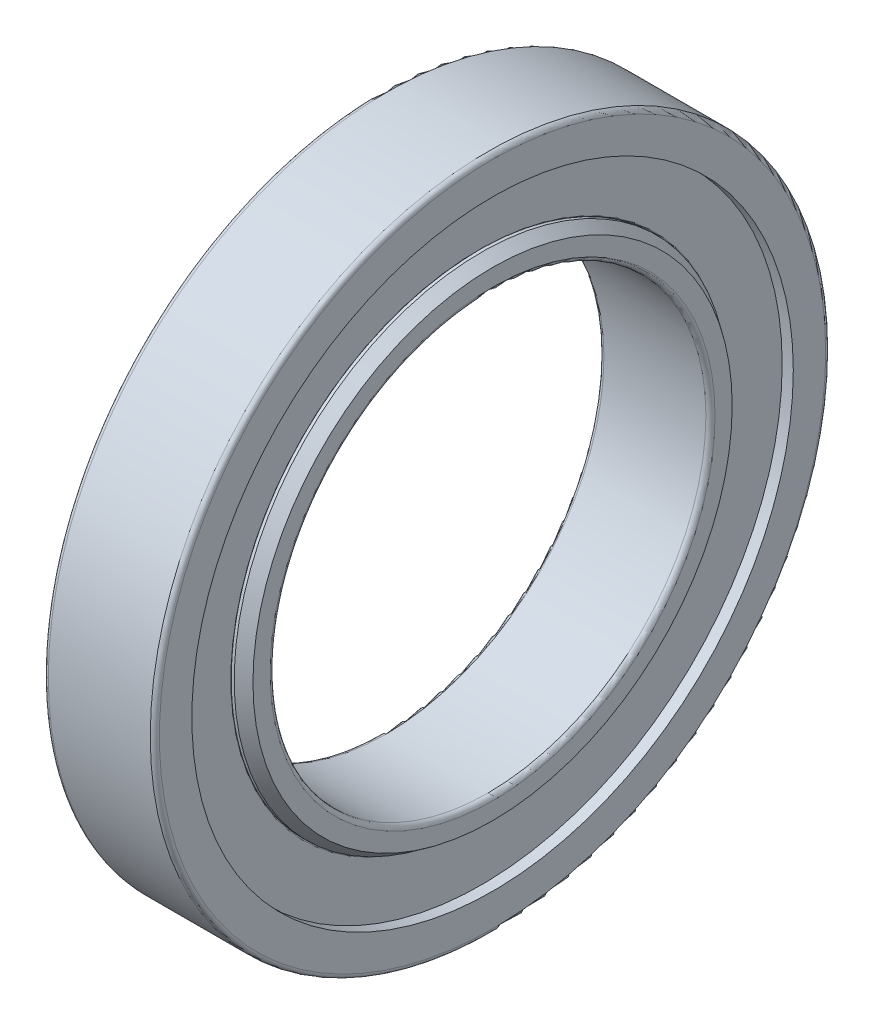
ISO-10303-21;
HEADER;
FILE_DESCRIPTION(('STEP AP214'),'2;1');
FILE_NAME('part.step','',(''),(''),'','','');
FILE_SCHEMA(('AUTOMOTIVE_DESIGN { 1 0 10303 214 1 1 1 1 }'));
ENDSEC;
DATA;
#1=APPLICATION_CONTEXT('core data for automotive mechanical design processes');
#2=APPLICATION_PROTOCOL_DEFINITION('international standard','automotive_design',2000,#1);
#3=PRODUCT_CONTEXT('',#1,'mechanical');
#4=PRODUCT('Part','Part','',(#3));
#5=PRODUCT_RELATED_PRODUCT_CATEGORY('part','',(#4));
#6=PRODUCT_DEFINITION_FORMATION('','',#4);
#7=PRODUCT_DEFINITION_CONTEXT('part definition',#1,'design');
#8=PRODUCT_DEFINITION('design','',#6,#7);
#9=PRODUCT_DEFINITION_SHAPE('','',#8);
#10=(LENGTH_UNIT() NAMED_UNIT(*) SI_UNIT(.MILLI.,.METRE.));
#11=(NAMED_UNIT(*) PLANE_ANGLE_UNIT() SI_UNIT($,.RADIAN.));
#12=(NAMED_UNIT(*) SI_UNIT($,.STERADIAN.) SOLID_ANGLE_UNIT());
#13=UNCERTAINTY_MEASURE_WITH_UNIT(LENGTH_MEASURE(1.E-05),#10,'distance_accuracy_value','');
#14=(GEOMETRIC_REPRESENTATION_CONTEXT(3) GLOBAL_UNCERTAINTY_ASSIGNED_CONTEXT((#13)) GLOBAL_UNIT_ASSIGNED_CONTEXT((#10,
#11,#12)) REPRESENTATION_CONTEXT('',''));
#15=CARTESIAN_POINT('',(0.,0.,0.));
#16=DIRECTION('',(0.,0.,1.));
#17=DIRECTION('',(1.,0.,0.));
#18=AXIS2_PLACEMENT_3D('',#15,#16,#17);
#19=CARTESIAN_POINT('',(-90.,0.,0.));
#20=DIRECTION('',(1.,0.,0.));
#21=DIRECTION('',(0.,0.,-1.));
#22=AXIS2_PLACEMENT_3D('',#19,#20,#21);
#23=CYLINDRICAL_SURFACE('',#22,141.525);
#24=CARTESIAN_POINT('',(-18.8935462373634,0.,0.));
#25=DIRECTION('',(1.,0.,0.));
#26=DIRECTION('',(0.,0.,-1.));
#27=AXIS2_PLACEMENT_3D('',#24,#25,#26);
#28=CIRCLE('',#27,141.525);
#29=CARTESIAN_POINT('',(-18.8935462373634,0.,-141.525));
#30=VERTEX_POINT('',#29);
#31=EDGE_CURVE('E42',#30,#30,#28,.F.);
#32=ORIENTED_EDGE('',*,*,#31,.F.);
#33=EDGE_LOOP('',(#32));
#34=FACE_BOUND('',#33,.T.);
#35=CARTESIAN_POINT('',(-20.4,0.,0.));
#36=DIRECTION('',(1.,0.,0.));
#37=DIRECTION('',(0.,0.,-1.));
#38=AXIS2_PLACEMENT_3D('',#35,#36,#37);
#39=CIRCLE('',#38,141.525);
#40=CARTESIAN_POINT('',(-20.4,0.,-141.525));
#41=VERTEX_POINT('',#40);
#42=EDGE_CURVE('E59',#41,#41,#39,.T.);
#43=ORIENTED_EDGE('',*,*,#42,.F.);
#44=EDGE_LOOP('',(#43));
#45=FACE_BOUND('',#44,.T.);
#46=ADVANCED_FACE('F30',(#34,#45),#23,.F.);
#47=CARTESIAN_POINT('',(-20.4,141.525,0.));
#48=DIRECTION('',(1.,0.,0.));
#49=DIRECTION('',(0.,0.,-1.));
#50=AXIS2_PLACEMENT_3D('',#47,#48,#49);
#51=PLANE('',#50);
#52=ORIENTED_EDGE('',*,*,#42,.T.);
#53=EDGE_LOOP('',(#52));
#54=FACE_BOUND('',#53,.T.);
#55=CARTESIAN_POINT('',(-20.4,0.,0.));
#56=DIRECTION('',(1.,0.,0.));
#57=DIRECTION('',(0.,0.,-1.));
#58=AXIS2_PLACEMENT_3D('',#55,#56,#57);
#59=CIRCLE('',#58,138.01875);
#60=CARTESIAN_POINT('',(-20.4,0.,-138.01875));
#61=VERTEX_POINT('',#60);
#62=EDGE_CURVE('E86',#61,#61,#59,.T.);
#63=ORIENTED_EDGE('',*,*,#62,.F.);
#64=EDGE_LOOP('',(#63));
#65=FACE_BOUND('',#64,.T.);
#66=ADVANCED_FACE('F32',(#54,#65),#51,.T.);
#67=CARTESIAN_POINT('',(-90.,0.,0.));
#68=DIRECTION('',(1.,0.,0.));
#69=DIRECTION('',(0.,0.,-1.));
#70=AXIS2_PLACEMENT_3D('',#67,#68,#69);
#71=CYLINDRICAL_SURFACE('',#70,138.01875);
#72=ORIENTED_EDGE('',*,*,#62,.T.);
#73=EDGE_LOOP('',(#72));
#74=FACE_BOUND('',#73,.T.);
#75=CARTESIAN_POINT('',(-25.5,0.,0.));
#76=DIRECTION('',(1.,0.,0.));
#77=DIRECTION('',(0.,0.,-1.));
#78=AXIS2_PLACEMENT_3D('',#75,#76,#77);
#79=CIRCLE('',#78,138.01875);
#80=CARTESIAN_POINT('',(-25.5,0.,-138.01875));
#81=VERTEX_POINT('',#80);
#82=EDGE_CURVE('E83',#81,#81,#79,.T.);
#83=ORIENTED_EDGE('',*,*,#82,.F.);
#84=EDGE_LOOP('',(#83));
#85=FACE_BOUND('',#84,.T.);
#86=ADVANCED_FACE('F105',(#74,#85),#71,.F.);
#87=CARTESIAN_POINT('',(-25.5,138.01875,0.));
#88=DIRECTION('',(-1.,0.,0.));
#89=DIRECTION('',(0.,0.,1.));
#90=AXIS2_PLACEMENT_3D('',#87,#88,#89);
#91=PLANE('',#90);
#92=ORIENTED_EDGE('',*,*,#82,.T.);
#93=EDGE_LOOP('',(#92));
#94=FACE_BOUND('',#93,.T.);
#95=CARTESIAN_POINT('',(-25.5,0.,0.));
#96=DIRECTION('',(1.,0.,0.));
#97=DIRECTION('',(0.,0.,-1.));
#98=AXIS2_PLACEMENT_3D('',#95,#96,#97);
#99=CIRCLE('',#98,152.9);
#100=CARTESIAN_POINT('',(-25.5,0.,-152.9));
#101=VERTEX_POINT('',#100);
#102=EDGE_CURVE('E80',#101,#101,#99,.T.);
#103=ORIENTED_EDGE('',*,*,#102,.F.);
#104=EDGE_LOOP('',(#103));
#105=FACE_BOUND('',#104,.T.);
#106=ADVANCED_FACE('F110',(#94,#105),#91,.T.);
#107=CARTESIAN_POINT('',(-23.4,0.,0.));
#108=DIRECTION('',(1.,0.,0.));
#109=DIRECTION('',(0.,0.,-1.));
#110=AXIS2_PLACEMENT_3D('',#107,#108,#109);
#111=TOROIDAL_SURFACE('',#110,152.9,2.09999999999999);
#112=ORIENTED_EDGE('',*,*,#102,.T.);
#113=EDGE_LOOP('',(#112));
#114=FACE_BOUND('',#113,.T.);
#115=CARTESIAN_POINT('',(-23.4,0.,0.));
#116=DIRECTION('',(1.,0.,0.));
#117=DIRECTION('',(0.,0.,-1.));
#118=AXIS2_PLACEMENT_3D('',#115,#116,#117);
#119=CIRCLE('',#118,155.);
#120=CARTESIAN_POINT('',(-23.4,0.,-155.));
#121=VERTEX_POINT('',#120);
#122=EDGE_CURVE('E77',#121,#121,#119,.T.);
#123=ORIENTED_EDGE('',*,*,#122,.F.);
#124=EDGE_LOOP('',(#123));
#125=FACE_BOUND('',#124,.T.);
#126=ADVANCED_FACE('F115',(#114,#125),#111,.T.);
#127=CARTESIAN_POINT('',(-90.,0.,0.));
#128=DIRECTION('',(1.,0.,0.));
#129=DIRECTION('',(0.,0.,-1.));
#130=AXIS2_PLACEMENT_3D('',#127,#128,#129);
#131=CYLINDRICAL_SURFACE('',#130,155.);
#132=ORIENTED_EDGE('',*,*,#122,.T.);
#133=EDGE_LOOP('',(#132));
#134=FACE_BOUND('',#133,.T.);
#135=CARTESIAN_POINT('',(23.4,0.,0.));
#136=DIRECTION('',(1.,0.,0.));
#137=DIRECTION('',(0.,0.,-1.));
#138=AXIS2_PLACEMENT_3D('',#135,#136,#137);
#139=CIRCLE('',#138,155.);
#140=CARTESIAN_POINT('',(23.4,0.,-155.));
#141=VERTEX_POINT('',#140);
#142=EDGE_CURVE('E74',#141,#141,#139,.T.);
#143=ORIENTED_EDGE('',*,*,#142,.F.);
#144=EDGE_LOOP('',(#143));
#145=FACE_BOUND('',#144,.T.);
#146=ADVANCED_FACE('F121',(#134,#145),#131,.T.);
#147=CARTESIAN_POINT('',(23.4,0.,0.));
#148=DIRECTION('',(1.,0.,0.));
#149=DIRECTION('',(0.,0.,-1.));
#150=AXIS2_PLACEMENT_3D('',#147,#148,#149);
#151=TOROIDAL_SURFACE('',#150,152.9,2.1);
#152=ORIENTED_EDGE('',*,*,#142,.T.);
#153=EDGE_LOOP('',(#152));
#154=FACE_BOUND('',#153,.T.);
#155=CARTESIAN_POINT('',(25.5,0.,0.));
#156=DIRECTION('',(1.,0.,0.));
#157=DIRECTION('',(0.,0.,-1.));
#158=AXIS2_PLACEMENT_3D('',#155,#156,#157);
#159=CIRCLE('',#158,152.9);
#160=CARTESIAN_POINT('',(25.5,0.,-152.9));
#161=VERTEX_POINT('',#160);
#162=EDGE_CURVE('E71',#161,#161,#159,.T.);
#163=ORIENTED_EDGE('',*,*,#162,.F.);
#164=EDGE_LOOP('',(#163));
#165=FACE_BOUND('',#164,.T.);
#166=ADVANCED_FACE('F127',(#154,#165),#151,.T.);
#167=CARTESIAN_POINT('',(25.5,152.9,0.));
#168=DIRECTION('',(1.,0.,0.));
#169=DIRECTION('',(0.,0.,-1.));
#170=AXIS2_PLACEMENT_3D('',#167,#168,#169);
#171=PLANE('',#170);
#172=ORIENTED_EDGE('',*,*,#162,.T.);
#173=EDGE_LOOP('',(#172));
#174=FACE_BOUND('',#173,.T.);
#175=CARTESIAN_POINT('',(25.5,0.,0.));
#176=DIRECTION('',(1.,0.,0.));
#177=DIRECTION('',(0.,0.,-1.));
#178=AXIS2_PLACEMENT_3D('',#175,#176,#177);
#179=CIRCLE('',#178,138.01875);
#180=CARTESIAN_POINT('',(25.5,0.,-138.01875));
#181=VERTEX_POINT('',#180);
#182=EDGE_CURVE('E68',#181,#181,#179,.T.);
#183=ORIENTED_EDGE('',*,*,#182,.F.);
#184=EDGE_LOOP('',(#183));
#185=FACE_BOUND('',#184,.T.);
#186=ADVANCED_FACE('F133',(#174,#185),#171,.T.);
#187=CARTESIAN_POINT('',(-90.,0.,0.));
#188=DIRECTION('',(1.,0.,0.));
#189=DIRECTION('',(0.,0.,-1.));
#190=AXIS2_PLACEMENT_3D('',#187,#188,#189);
#191=CYLINDRICAL_SURFACE('',#190,138.01875);
#192=ORIENTED_EDGE('',*,*,#182,.T.);
#193=EDGE_LOOP('',(#192));
#194=FACE_BOUND('',#193,.T.);
#195=CARTESIAN_POINT('',(20.4,0.,0.));
#196=DIRECTION('',(1.,0.,0.));
#197=DIRECTION('',(0.,0.,-1.));
#198=AXIS2_PLACEMENT_3D('',#195,#196,#197);
#199=CIRCLE('',#198,138.01875);
#200=CARTESIAN_POINT('',(20.4,0.,-138.01875));
#201=VERTEX_POINT('',#200);
#202=EDGE_CURVE('E65',#201,#201,#199,.T.);
#203=ORIENTED_EDGE('',*,*,#202,.F.);
#204=EDGE_LOOP('',(#203));
#205=FACE_BOUND('',#204,.T.);
#206=ADVANCED_FACE('F139',(#194,#205),#191,.F.);
#207=CARTESIAN_POINT('',(20.4,138.01875,0.));
#208=DIRECTION('',(-1.,0.,0.));
#209=DIRECTION('',(0.,0.,1.));
#210=AXIS2_PLACEMENT_3D('',#207,#208,#209);
#211=PLANE('',#210);
#212=ORIENTED_EDGE('',*,*,#202,.T.);
#213=EDGE_LOOP('',(#212));
#214=FACE_BOUND('',#213,.T.);
#215=CARTESIAN_POINT('',(20.4,0.,0.));
#216=DIRECTION('',(1.,0.,0.));
#217=DIRECTION('',(0.,0.,-1.));
#218=AXIS2_PLACEMENT_3D('',#215,#216,#217);
#219=CIRCLE('',#218,141.525);
#220=CARTESIAN_POINT('',(20.4,0.,-141.525));
#221=VERTEX_POINT('',#220);
#222=EDGE_CURVE('E62',#221,#221,#219,.T.);
#223=ORIENTED_EDGE('',*,*,#222,.F.);
#224=EDGE_LOOP('',(#223));
#225=FACE_BOUND('',#224,.T.);
#226=ADVANCED_FACE('F145',(#214,#225),#211,.T.);
#227=CARTESIAN_POINT('',(18.8935462373635,0.,0.));
#228=DIRECTION('',(-1.,0.,0.));
#229=DIRECTION('',(0.,0.,1.));
#230=AXIS2_PLACEMENT_3D('',#227,#228,#229);
#231=CIRCLE('',#230,141.525);
#232=CARTESIAN_POINT('',(18.8935462373635,0.,141.525));
#233=VERTEX_POINT('',#232);
#234=EDGE_CURVE('E89',#233,#233,#231,.F.);
#235=ORIENTED_EDGE('',*,*,#234,.F.);
#236=EDGE_LOOP('',(#235));
#237=FACE_BOUND('',#236,.T.);
#238=ORIENTED_EDGE('',*,*,#222,.T.);
#239=EDGE_LOOP('',(#238));
#240=FACE_BOUND('',#239,.T.);
#241=ADVANCED_FACE('F100',(#237,#240),#23,.F.);
#242=CARTESIAN_POINT('',(-18.8188,0.,0.));
#243=DIRECTION('',(1.,0.,0.));
#244=DIRECTION('',(0.,0.,-1.));
#245=AXIS2_PLACEMENT_3D('',#242,#243,#244);
#246=TOROIDAL_SURFACE('',#245,140.9688,0.561199999999993);
#247=ORIENTED_EDGE('',*,*,#31,.T.);
#248=EDGE_LOOP('',(#247));
#249=FACE_BOUND('',#248,.T.);
#250=CARTESIAN_POINT('',(-19.38,0.,0.));
#251=DIRECTION('',(1.,0.,0.));
#252=DIRECTION('',(0.,0.,-1.));
#253=AXIS2_PLACEMENT_3D('',#250,#251,#252);
#254=CIRCLE('',#253,140.9688);
#255=CARTESIAN_POINT('',(-19.38,0.,-140.9688));
#256=VERTEX_POINT('',#255);
#257=EDGE_CURVE('E56',#256,#256,#254,.T.);
#258=ORIENTED_EDGE('',*,*,#257,.T.);
#259=EDGE_LOOP('',(#258));
#260=FACE_BOUND('',#259,.T.);
#261=ADVANCED_FACE('F94',(#249,#260),#246,.T.);
#262=CARTESIAN_POINT('',(-19.38,140.9688,0.));
#263=DIRECTION('',(-1.,0.,0.));
#264=DIRECTION('',(0.,0.,1.));
#265=AXIS2_PLACEMENT_3D('',#262,#263,#264);
#266=PLANE('',#265);
#267=CARTESIAN_POINT('',(-19.38,0.,0.));
#268=DIRECTION('',(1.,0.,0.));
#269=DIRECTION('',(0.,0.,-1.));
#270=AXIS2_PLACEMENT_3D('',#267,#268,#269);
#271=CIRCLE('',#270,114.0312);
#272=CARTESIAN_POINT('',(-19.38,0.,-114.0312));
#273=VERTEX_POINT('',#272);
#274=EDGE_CURVE('E53',#273,#273,#271,.T.);
#275=ORIENTED_EDGE('',*,*,#274,.T.);
#276=EDGE_LOOP('',(#275));
#277=FACE_BOUND('',#276,.T.);
#278=ORIENTED_EDGE('',*,*,#257,.F.);
#279=EDGE_LOOP('',(#278));
#280=FACE_BOUND('',#279,.T.);
#281=ADVANCED_FACE('F159',(#277,#280),#266,.T.);
#282=CARTESIAN_POINT('',(-18.8188,0.,0.));
#283=DIRECTION('',(1.,0.,0.));
#284=DIRECTION('',(0.,0.,-1.));
#285=AXIS2_PLACEMENT_3D('',#282,#283,#284);
#286=TOROIDAL_SURFACE('',#285,114.0312,0.56120000000001);
#287=CARTESIAN_POINT('',(-18.8935462373637,0.,0.));
#288=DIRECTION('',(1.,0.,0.));
#289=DIRECTION('',(0.,0.,-1.));
#290=AXIS2_PLACEMENT_3D('',#287,#288,#289);
#291=CIRCLE('',#290,113.475);
#292=CARTESIAN_POINT('',(-18.8935462373637,0.,-113.475));
#293=VERTEX_POINT('',#292);
#294=EDGE_CURVE('E10',#293,#293,#291,.F.);
#295=ORIENTED_EDGE('',*,*,#294,.F.);
#296=EDGE_LOOP('',(#295));
#297=FACE_BOUND('',#296,.T.);
#298=ORIENTED_EDGE('',*,*,#274,.F.);
#299=EDGE_LOOP('',(#298));
#300=FACE_BOUND('',#299,.T.);
#301=ADVANCED_FACE('F165',(#297,#300),#286,.T.);
#302=CARTESIAN_POINT('',(18.8188,0.,0.));
#303=DIRECTION('',(1.,0.,0.));
#304=DIRECTION('',(0.,0.,-1.));
#305=AXIS2_PLACEMENT_3D('',#302,#303,#304);
#306=TOROIDAL_SURFACE('',#305,114.0312,0.5612);
#307=CARTESIAN_POINT('',(18.8935462373636,0.,0.));
#308=DIRECTION('',(-1.,0.,0.));
#309=DIRECTION('',(0.,0.,1.));
#310=AXIS2_PLACEMENT_3D('',#307,#308,#309);
#311=CIRCLE('',#310,113.475);
#312=CARTESIAN_POINT('',(18.8935462373636,0.,113.475));
#313=VERTEX_POINT('',#312);
#314=EDGE_CURVE('E34',#313,#313,#311,.F.);
#315=ORIENTED_EDGE('',*,*,#314,.F.);
#316=EDGE_LOOP('',(#315));
#317=FACE_BOUND('',#316,.T.);
#318=CARTESIAN_POINT('',(19.38,0.,0.));
#319=DIRECTION('',(1.,0.,0.));
#320=DIRECTION('',(0.,0.,-1.));
#321=AXIS2_PLACEMENT_3D('',#318,#319,#320);
#322=CIRCLE('',#321,114.0312);
#323=CARTESIAN_POINT('',(19.38,0.,-114.0312));
#324=VERTEX_POINT('',#323);
#325=EDGE_CURVE('E50',#324,#324,#322,.T.);
#326=ORIENTED_EDGE('',*,*,#325,.T.);
#327=EDGE_LOOP('',(#326));
#328=FACE_BOUND('',#327,.T.);
#329=ADVANCED_FACE('F169',(#317,#328),#306,.T.);
#330=CARTESIAN_POINT('',(19.38,114.0312,0.));
#331=DIRECTION('',(1.,0.,0.));
#332=DIRECTION('',(0.,0.,-1.));
#333=AXIS2_PLACEMENT_3D('',#330,#331,#332);
#334=PLANE('',#333);
#335=CARTESIAN_POINT('',(19.38,0.,0.));
#336=DIRECTION('',(1.,0.,0.));
#337=DIRECTION('',(0.,0.,-1.));
#338=AXIS2_PLACEMENT_3D('',#335,#336,#337);
#339=CIRCLE('',#338,140.9688);
#340=CARTESIAN_POINT('',(19.38,0.,-140.9688));
#341=VERTEX_POINT('',#340);
#342=EDGE_CURVE('E47',#341,#341,#339,.T.);
#343=ORIENTED_EDGE('',*,*,#342,.T.);
#344=EDGE_LOOP('',(#343));
#345=FACE_BOUND('',#344,.T.);
#346=ORIENTED_EDGE('',*,*,#325,.F.);
#347=EDGE_LOOP('',(#346));
#348=FACE_BOUND('',#347,.T.);
#349=ADVANCED_FACE('F173',(#345,#348),#334,.T.);
#350=CARTESIAN_POINT('',(18.8188,0.,0.));
#351=DIRECTION('',(1.,0.,0.));
#352=DIRECTION('',(0.,0.,-1.));
#353=AXIS2_PLACEMENT_3D('',#350,#351,#352);
#354=TOROIDAL_SURFACE('',#353,140.9688,0.561200000000006);
#355=ORIENTED_EDGE('',*,*,#234,.T.);
#356=EDGE_LOOP('',(#355));
#357=FACE_BOUND('',#356,.T.);
#358=ORIENTED_EDGE('',*,*,#342,.F.);
#359=EDGE_LOOP('',(#358));
#360=FACE_BOUND('',#359,.T.);
#361=ADVANCED_FACE('F177',(#357,#360),#354,.T.);
#362=CARTESIAN_POINT('',(-90.,0.,0.));
#363=DIRECTION('',(1.,0.,0.));
#364=DIRECTION('',(0.,0.,-1.));
#365=AXIS2_PLACEMENT_3D('',#362,#363,#364);
#366=CYLINDRICAL_SURFACE('',#365,113.475);
#367=ORIENTED_EDGE('',*,*,#294,.T.);
#368=EDGE_LOOP('',(#367));
#369=FACE_BOUND('',#368,.T.);
#370=CARTESIAN_POINT('',(-20.4,0.,0.));
#371=DIRECTION('',(1.,0.,0.));
#372=DIRECTION('',(0.,0.,-1.));
#373=AXIS2_PLACEMENT_3D('',#370,#371,#372);
#374=CIRCLE('',#373,113.475);
#375=CARTESIAN_POINT('',(-20.4,0.,-113.475));
#376=VERTEX_POINT('',#375);
#377=EDGE_CURVE('E45',#376,#376,#374,.T.);
#378=ORIENTED_EDGE('',*,*,#377,.T.);
#379=EDGE_LOOP('',(#378));
#380=FACE_BOUND('',#379,.T.);
#381=ADVANCED_FACE('F181',(#369,#380),#366,.T.);
#382=ORIENTED_EDGE('',*,*,#314,.T.);
#383=EDGE_LOOP('',(#382));
#384=FACE_BOUND('',#383,.T.);
#385=CARTESIAN_POINT('',(20.4,0.,0.));
#386=DIRECTION('',(1.,0.,0.));
#387=DIRECTION('',(0.,0.,-1.));
#388=AXIS2_PLACEMENT_3D('',#385,#386,#387);
#389=CIRCLE('',#388,113.475);
#390=CARTESIAN_POINT('',(20.4,0.,-113.475));
#391=VERTEX_POINT('',#390);
#392=EDGE_CURVE('E219',#391,#391,#389,.T.);
#393=ORIENTED_EDGE('',*,*,#392,.F.);
#394=EDGE_LOOP('',(#393));
#395=FACE_BOUND('',#394,.T.);
#396=ADVANCED_FACE('F183',(#384,#395),#366,.T.);
#397=CARTESIAN_POINT('',(-20.4,0.,0.));
#398=DIRECTION('',(1.,0.,0.));
#399=DIRECTION('',(0.,0.,-1.));
#400=AXIS2_PLACEMENT_3D('',#397,#398,#399);
#401=CONICAL_SURFACE('',#400,113.475,0.602287346134963);
#402=CARTESIAN_POINT('',(-25.5,0.,0.));
#403=DIRECTION('',(1.,0.,0.));
#404=DIRECTION('',(0.,0.,-1.));
#405=AXIS2_PLACEMENT_3D('',#402,#403,#404);
#406=CIRCLE('',#405,109.96875);
#407=CARTESIAN_POINT('',(-25.5,0.,-109.96875));
#408=VERTEX_POINT('',#407);
#409=EDGE_CURVE('E237',#408,#408,#406,.T.);
#410=ORIENTED_EDGE('',*,*,#409,.T.);
#411=EDGE_LOOP('',(#410));
#412=FACE_BOUND('',#411,.T.);
#413=ORIENTED_EDGE('',*,*,#377,.F.);
#414=EDGE_LOOP('',(#413));
#415=FACE_BOUND('',#414,.T.);
#416=ADVANCED_FACE('F186',(#412,#415),#401,.T.);
#417=CARTESIAN_POINT('',(-25.5,109.96875,0.));
#418=DIRECTION('',(-1.,0.,0.));
#419=DIRECTION('',(0.,0.,1.));
#420=AXIS2_PLACEMENT_3D('',#417,#418,#419);
#421=PLANE('',#420);
#422=CARTESIAN_POINT('',(-25.5,0.,0.));
#423=DIRECTION('',(1.,0.,0.));
#424=DIRECTION('',(0.,0.,-1.));
#425=AXIS2_PLACEMENT_3D('',#422,#423,#424);
#426=CIRCLE('',#425,102.1);
#427=CARTESIAN_POINT('',(-25.5,0.,-102.1));
#428=VERTEX_POINT('',#427);
#429=EDGE_CURVE('E235',#428,#428,#426,.T.);
#430=ORIENTED_EDGE('',*,*,#429,.T.);
#431=EDGE_LOOP('',(#430));
#432=FACE_BOUND('',#431,.T.);
#433=ORIENTED_EDGE('',*,*,#409,.F.);
#434=EDGE_LOOP('',(#433));
#435=FACE_BOUND('',#434,.T.);
#436=ADVANCED_FACE('F190',(#432,#435),#421,.T.);
#437=CARTESIAN_POINT('',(-23.4,0.,0.));
#438=DIRECTION('',(1.,0.,0.));
#439=DIRECTION('',(0.,0.,-1.));
#440=AXIS2_PLACEMENT_3D('',#437,#438,#439);
#441=TOROIDAL_SURFACE('',#440,102.1,2.10000000000002);
#442=CARTESIAN_POINT('',(-23.4,0.,0.));
#443=DIRECTION('',(1.,0.,0.));
#444=DIRECTION('',(0.,0.,-1.));
#445=AXIS2_PLACEMENT_3D('',#442,#443,#444);
#446=CIRCLE('',#445,100.);
#447=CARTESIAN_POINT('',(-23.4,0.,-100.));
#448=VERTEX_POINT('',#447);
#449=EDGE_CURVE('E232',#448,#448,#446,.T.);
#450=ORIENTED_EDGE('',*,*,#449,.T.);
#451=EDGE_LOOP('',(#450));
#452=FACE_BOUND('',#451,.T.);
#453=ORIENTED_EDGE('',*,*,#429,.F.);
#454=EDGE_LOOP('',(#453));
#455=FACE_BOUND('',#454,.T.);
#456=ADVANCED_FACE('F194',(#452,#455),#441,.T.);
#457=CARTESIAN_POINT('',(-90.,0.,0.));
#458=DIRECTION('',(1.,0.,0.));
#459=DIRECTION('',(0.,0.,-1.));
#460=AXIS2_PLACEMENT_3D('',#457,#458,#459);
#461=CYLINDRICAL_SURFACE('',#460,100.);
#462=CARTESIAN_POINT('',(23.4,0.,0.));
#463=DIRECTION('',(1.,0.,0.));
#464=DIRECTION('',(0.,0.,-1.));
#465=AXIS2_PLACEMENT_3D('',#462,#463,#464);
#466=CIRCLE('',#465,100.);
#467=CARTESIAN_POINT('',(23.4,0.,-100.));
#468=VERTEX_POINT('',#467);
#469=EDGE_CURVE('E226',#468,#468,#466,.T.);
#470=ORIENTED_EDGE('',*,*,#469,.T.);
#471=EDGE_LOOP('',(#470));
#472=FACE_BOUND('',#471,.T.);
#473=ORIENTED_EDGE('',*,*,#449,.F.);
#474=EDGE_LOOP('',(#473));
#475=FACE_BOUND('',#474,.T.);
#476=ADVANCED_FACE('F198',(#472,#475),#461,.F.);
#477=CARTESIAN_POINT('',(23.4,0.,0.));
#478=DIRECTION('',(1.,0.,0.));
#479=DIRECTION('',(0.,0.,-1.));
#480=AXIS2_PLACEMENT_3D('',#477,#478,#479);
#481=TOROIDAL_SURFACE('',#480,102.1,2.10000000000001);
#482=CARTESIAN_POINT('',(25.5,0.,0.));
#483=DIRECTION('',(1.,0.,0.));
#484=DIRECTION('',(0.,0.,-1.));
#485=AXIS2_PLACEMENT_3D('',#482,#483,#484);
#486=CIRCLE('',#485,102.1);
#487=CARTESIAN_POINT('',(25.5,0.,-102.1));
#488=VERTEX_POINT('',#487);
#489=EDGE_CURVE('E223',#488,#488,#486,.T.);
#490=ORIENTED_EDGE('',*,*,#489,.T.);
#491=EDGE_LOOP('',(#490));
#492=FACE_BOUND('',#491,.T.);
#493=ORIENTED_EDGE('',*,*,#469,.F.);
#494=EDGE_LOOP('',(#493));
#495=FACE_BOUND('',#494,.T.);
#496=ADVANCED_FACE('F202',(#492,#495),#481,.T.);
#497=CARTESIAN_POINT('',(25.5,102.1,0.));
#498=DIRECTION('',(1.,0.,0.));
#499=DIRECTION('',(0.,0.,-1.));
#500=AXIS2_PLACEMENT_3D('',#497,#498,#499);
#501=PLANE('',#500);
#502=CARTESIAN_POINT('',(25.5,0.,0.));
#503=DIRECTION('',(1.,0.,0.));
#504=DIRECTION('',(0.,0.,-1.));
#505=AXIS2_PLACEMENT_3D('',#502,#503,#504);
#506=CIRCLE('',#505,109.96875);
#507=CARTESIAN_POINT('',(25.5,0.,-109.96875));
#508=VERTEX_POINT('',#507);
#509=EDGE_CURVE('E222',#508,#508,#506,.T.);
#510=ORIENTED_EDGE('',*,*,#509,.T.);
#511=EDGE_LOOP('',(#510));
#512=FACE_BOUND('',#511,.T.);
#513=ORIENTED_EDGE('',*,*,#489,.F.);
#514=EDGE_LOOP('',(#513));
#515=FACE_BOUND('',#514,.T.);
#516=ADVANCED_FACE('F206',(#512,#515),#501,.T.);
#517=CARTESIAN_POINT('',(25.5,0.,0.));
#518=DIRECTION('',(-1.,0.,0.));
#519=DIRECTION('',(0.,0.,1.));
#520=AXIS2_PLACEMENT_3D('',#517,#518,#519);
#521=CONICAL_SURFACE('',#520,109.96875,0.602287346134972);
#522=ORIENTED_EDGE('',*,*,#392,.T.);
#523=EDGE_LOOP('',(#522));
#524=FACE_BOUND('',#523,.T.);
#525=ORIENTED_EDGE('',*,*,#509,.F.);
#526=EDGE_LOOP('',(#525));
#527=FACE_BOUND('',#526,.T.);
#528=ADVANCED_FACE('F210',(#524,#527),#521,.T.);
#529=CLOSED_SHELL('',(#46,#66,#86,#106,#126,#146,#166,#186,#206,#226,#241,#261,#281,#301,#329,
#349,#361,#381,#396,#416,#436,#456,#476,#496,#516,#528));
#530=MANIFOLD_SOLID_BREP('B2',#529);
#531=ADVANCED_BREP_SHAPE_REPRESENTATION('',(#18,#530),#14);
#532=SHAPE_DEFINITION_REPRESENTATION(#9,#531);
ENDSEC;
END-ISO-10303-21;
